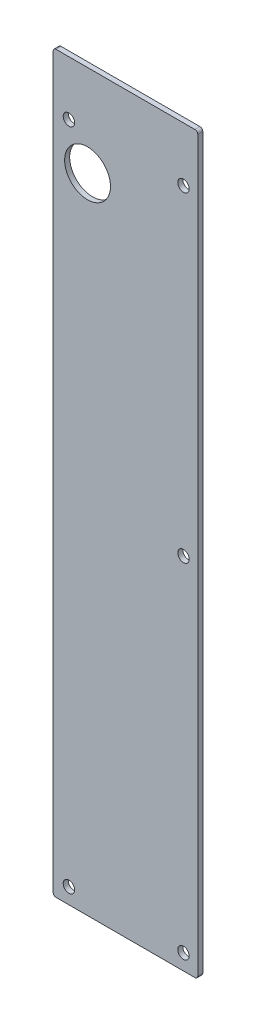
ISO-10303-21;
HEADER;
FILE_DESCRIPTION(('STEP AP214'),'2;1');
FILE_NAME('part.step','',(''),(''),'','','');
FILE_SCHEMA(('AUTOMOTIVE_DESIGN { 1 0 10303 214 1 1 1 1 }'));
ENDSEC;
DATA;
#1=APPLICATION_CONTEXT('core data for automotive mechanical design processes');
#2=APPLICATION_PROTOCOL_DEFINITION('international standard','automotive_design',2000,#1);
#3=PRODUCT_CONTEXT('',#1,'mechanical');
#4=PRODUCT('Part','Part','',(#3));
#5=PRODUCT_RELATED_PRODUCT_CATEGORY('part','',(#4));
#6=PRODUCT_DEFINITION_FORMATION('','',#4);
#7=PRODUCT_DEFINITION_CONTEXT('part definition',#1,'design');
#8=PRODUCT_DEFINITION('design','',#6,#7);
#9=PRODUCT_DEFINITION_SHAPE('','',#8);
#10=(LENGTH_UNIT() NAMED_UNIT(*) SI_UNIT(.MILLI.,.METRE.));
#11=(NAMED_UNIT(*) PLANE_ANGLE_UNIT() SI_UNIT($,.RADIAN.));
#12=(NAMED_UNIT(*) SI_UNIT($,.STERADIAN.) SOLID_ANGLE_UNIT());
#13=UNCERTAINTY_MEASURE_WITH_UNIT(LENGTH_MEASURE(1.E-05),#10,'distance_accuracy_value','');
#14=(GEOMETRIC_REPRESENTATION_CONTEXT(3) GLOBAL_UNCERTAINTY_ASSIGNED_CONTEXT((#13)) GLOBAL_UNIT_ASSIGNED_CONTEXT((#10,
#11,#12)) REPRESENTATION_CONTEXT('',''));
#15=CARTESIAN_POINT('',(0.,0.,0.));
#16=DIRECTION('',(0.,0.,1.));
#17=DIRECTION('',(1.,0.,0.));
#18=AXIS2_PLACEMENT_3D('',#15,#16,#17);
#19=CARTESIAN_POINT('',(0.,0.,5.588));
#20=DIRECTION('',(1.,0.,0.));
#21=DIRECTION('',(0.,0.,-1.));
#22=AXIS2_PLACEMENT_3D('',#19,#20,#21);
#23=PLANE('',#22);
#24=DIRECTION('',(0.,-1.,0.));
#25=VECTOR('',#24,1.);
#26=CARTESIAN_POINT('',(0.,0.,0.));
#27=LINE('',#26,#25);
#28=CARTESIAN_POINT('',(0.,811.2125,0.));
#29=VERTEX_POINT('',#28);
#30=CARTESIAN_POINT('',(0.,3.175,0.));
#31=VERTEX_POINT('',#30);
#32=EDGE_CURVE('E127',#29,#31,#27,.T.);
#33=ORIENTED_EDGE('',*,*,#32,.T.);
#34=DIRECTION('',(0.,0.,-1.));
#35=VECTOR('',#34,1.);
#36=CARTESIAN_POINT('',(0.,3.175,5.588));
#37=LINE('',#36,#35);
#38=CARTESIAN_POINT('',(0.,3.175,5.588));
#39=VERTEX_POINT('',#38);
#40=EDGE_CURVE('E105',#31,#39,#37,.F.);
#41=ORIENTED_EDGE('',*,*,#40,.T.);
#42=DIRECTION('',(0.,-1.,0.));
#43=VECTOR('',#42,1.);
#44=CARTESIAN_POINT('',(0.,0.,5.588));
#45=LINE('',#44,#43);
#46=CARTESIAN_POINT('',(0.,811.2125,5.588));
#47=VERTEX_POINT('',#46);
#48=EDGE_CURVE('E137',#47,#39,#45,.T.);
#49=ORIENTED_EDGE('',*,*,#48,.F.);
#50=DIRECTION('',(0.,0.,-1.));
#51=VECTOR('',#50,1.);
#52=CARTESIAN_POINT('',(0.,811.2125,5.588));
#53=LINE('',#52,#51);
#54=EDGE_CURVE('E110',#47,#29,#53,.T.);
#55=ORIENTED_EDGE('',*,*,#54,.T.);
#56=EDGE_LOOP('',(#33,#41,#49,#55));
#57=FACE_BOUND('',#56,.T.);
#58=ADVANCED_FACE('F33',(#57),#23,.F.);
#59=CARTESIAN_POINT('',(0.,0.,5.588));
#60=DIRECTION('',(0.,1.,0.));
#61=DIRECTION('',(0.,0.,1.));
#62=AXIS2_PLACEMENT_3D('',#59,#60,#61);
#63=PLANE('',#62);
#64=DIRECTION('',(1.,0.,0.));
#65=VECTOR('',#64,1.);
#66=CARTESIAN_POINT('',(0.,0.,5.588));
#67=LINE('',#66,#65);
#68=CARTESIAN_POINT('',(3.175,0.,5.588));
#69=VERTEX_POINT('',#68);
#70=CARTESIAN_POINT('',(157.1625,0.,5.588));
#71=VERTEX_POINT('',#70);
#72=EDGE_CURVE('E120',#69,#71,#67,.T.);
#73=ORIENTED_EDGE('',*,*,#72,.F.);
#74=DIRECTION('',(0.,0.,-1.));
#75=VECTOR('',#74,1.);
#76=CARTESIAN_POINT('',(3.175,0.,5.588));
#77=LINE('',#76,#75);
#78=CARTESIAN_POINT('',(3.175,0.,0.));
#79=VERTEX_POINT('',#78);
#80=EDGE_CURVE('E104',#69,#79,#77,.T.);
#81=ORIENTED_EDGE('',*,*,#80,.T.);
#82=DIRECTION('',(1.,0.,0.));
#83=VECTOR('',#82,1.);
#84=CARTESIAN_POINT('',(0.,0.,0.));
#85=LINE('',#84,#83);
#86=CARTESIAN_POINT('',(157.1625,0.,0.));
#87=VERTEX_POINT('',#86);
#88=EDGE_CURVE('E117',#79,#87,#85,.T.);
#89=ORIENTED_EDGE('',*,*,#88,.T.);
#90=DIRECTION('',(0.,0.,-1.));
#91=VECTOR('',#90,1.);
#92=CARTESIAN_POINT('',(157.1625,0.,5.588));
#93=LINE('',#92,#91);
#94=EDGE_CURVE('E122',#87,#71,#93,.F.);
#95=ORIENTED_EDGE('',*,*,#94,.T.);
#96=EDGE_LOOP('',(#73,#81,#89,#95));
#97=FACE_BOUND('',#96,.T.);
#98=ADVANCED_FACE('F116',(#97),#63,.F.);
#99=CARTESIAN_POINT('',(160.3375,0.,5.588));
#100=DIRECTION('',(-1.,0.,0.));
#101=DIRECTION('',(0.,0.,1.));
#102=AXIS2_PLACEMENT_3D('',#99,#100,#101);
#103=PLANE('',#102);
#104=DIRECTION('',(0.,1.,0.));
#105=VECTOR('',#104,1.);
#106=CARTESIAN_POINT('',(160.3375,0.,5.588));
#107=LINE('',#106,#105);
#108=CARTESIAN_POINT('',(160.3375,3.175,5.588));
#109=VERTEX_POINT('',#108);
#110=CARTESIAN_POINT('',(160.3375,811.2125,5.588));
#111=VERTEX_POINT('',#110);
#112=EDGE_CURVE('E194',#109,#111,#107,.T.);
#113=ORIENTED_EDGE('',*,*,#112,.F.);
#114=DIRECTION('',(0.,0.,-1.));
#115=VECTOR('',#114,1.);
#116=CARTESIAN_POINT('',(160.3375,3.175,5.588));
#117=LINE('',#116,#115);
#118=CARTESIAN_POINT('',(160.3375,3.175,0.));
#119=VERTEX_POINT('',#118);
#120=EDGE_CURVE('E156',#109,#119,#117,.T.);
#121=ORIENTED_EDGE('',*,*,#120,.T.);
#122=DIRECTION('',(0.,1.,0.));
#123=VECTOR('',#122,1.);
#124=CARTESIAN_POINT('',(160.3375,0.,0.));
#125=LINE('',#124,#123);
#126=CARTESIAN_POINT('',(160.3375,811.2125,0.));
#127=VERTEX_POINT('',#126);
#128=EDGE_CURVE('E126',#119,#127,#125,.T.);
#129=ORIENTED_EDGE('',*,*,#128,.T.);
#130=DIRECTION('',(0.,0.,-1.));
#131=VECTOR('',#130,1.);
#132=CARTESIAN_POINT('',(160.3375,811.2125,5.588));
#133=LINE('',#132,#131);
#134=EDGE_CURVE('E154',#127,#111,#133,.F.);
#135=ORIENTED_EDGE('',*,*,#134,.T.);
#136=EDGE_LOOP('',(#113,#121,#129,#135));
#137=FACE_BOUND('',#136,.T.);
#138=ADVANCED_FACE('F209',(#137),#103,.F.);
#139=CARTESIAN_POINT('',(0.,814.3875,5.588));
#140=DIRECTION('',(0.,-1.,0.));
#141=DIRECTION('',(0.,0.,-1.));
#142=AXIS2_PLACEMENT_3D('',#139,#140,#141);
#143=PLANE('',#142);
#144=DIRECTION('',(-1.,0.,0.));
#145=VECTOR('',#144,1.);
#146=CARTESIAN_POINT('',(0.,814.3875,0.));
#147=LINE('',#146,#145);
#148=CARTESIAN_POINT('',(157.1625,814.3875,0.));
#149=VERTEX_POINT('',#148);
#150=CARTESIAN_POINT('',(3.175,814.3875,0.));
#151=VERTEX_POINT('',#150);
#152=EDGE_CURVE('E130',#149,#151,#147,.T.);
#153=ORIENTED_EDGE('',*,*,#152,.T.);
#154=DIRECTION('',(0.,0.,-1.));
#155=VECTOR('',#154,1.);
#156=CARTESIAN_POINT('',(3.175,814.3875,5.588));
#157=LINE('',#156,#155);
#158=CARTESIAN_POINT('',(3.175,814.3875,5.588));
#159=VERTEX_POINT('',#158);
#160=EDGE_CURVE('E11',#151,#159,#157,.F.);
#161=ORIENTED_EDGE('',*,*,#160,.T.);
#162=DIRECTION('',(-1.,0.,0.));
#163=VECTOR('',#162,1.);
#164=CARTESIAN_POINT('',(0.,814.3875,5.588));
#165=LINE('',#164,#163);
#166=CARTESIAN_POINT('',(157.1625,814.3875,5.588));
#167=VERTEX_POINT('',#166);
#168=EDGE_CURVE('E138',#167,#159,#165,.T.);
#169=ORIENTED_EDGE('',*,*,#168,.F.);
#170=DIRECTION('',(0.,0.,-1.));
#171=VECTOR('',#170,1.);
#172=CARTESIAN_POINT('',(157.1625,814.3875,5.588));
#173=LINE('',#172,#171);
#174=EDGE_CURVE('E42',#167,#149,#173,.T.);
#175=ORIENTED_EDGE('',*,*,#174,.T.);
#176=EDGE_LOOP('',(#153,#161,#169,#175));
#177=FACE_BOUND('',#176,.T.);
#178=ADVANCED_FACE('F204',(#177),#143,.F.);
#179=CARTESIAN_POINT('',(0.,0.,5.588));
#180=DIRECTION('',(0.,0.,-1.));
#181=DIRECTION('',(-1.,0.,0.));
#182=AXIS2_PLACEMENT_3D('',#179,#180,#181);
#183=PLANE('',#182);
#184=CARTESIAN_POINT('',(38.1,712.7875,5.588));
#185=DIRECTION('',(0.,0.,1.));
#186=DIRECTION('',(1.,0.,0.));
#187=AXIS2_PLACEMENT_3D('',#184,#185,#186);
#188=CIRCLE('',#187,25.4);
#189=CARTESIAN_POINT('',(63.5,712.7875,5.588));
#190=VERTEX_POINT('',#189);
#191=EDGE_CURVE('E268',#190,#190,#188,.T.);
#192=ORIENTED_EDGE('',*,*,#191,.F.);
#193=EDGE_LOOP('',(#192));
#194=FACE_BOUND('',#193,.T.);
#195=CARTESIAN_POINT('',(144.4625,398.4625,5.588));
#196=DIRECTION('',(0.,0.,1.));
#197=DIRECTION('',(1.,0.,0.));
#198=AXIS2_PLACEMENT_3D('',#195,#196,#197);
#199=CIRCLE('',#198,6.34999999999999);
#200=CARTESIAN_POINT('',(150.8125,398.4625,5.588));
#201=VERTEX_POINT('',#200);
#202=EDGE_CURVE('E183',#201,#201,#199,.T.);
#203=ORIENTED_EDGE('',*,*,#202,.F.);
#204=EDGE_LOOP('',(#203));
#205=FACE_BOUND('',#204,.T.);
#206=CARTESIAN_POINT('',(144.4625,17.4624999999999,5.588));
#207=DIRECTION('',(0.,0.,1.));
#208=DIRECTION('',(1.,0.,0.));
#209=AXIS2_PLACEMENT_3D('',#206,#207,#208);
#210=CIRCLE('',#209,6.35);
#211=CARTESIAN_POINT('',(150.8125,17.4624999999999,5.588));
#212=VERTEX_POINT('',#211);
#213=EDGE_CURVE('E173',#212,#212,#210,.T.);
#214=ORIENTED_EDGE('',*,*,#213,.F.);
#215=EDGE_LOOP('',(#214));
#216=FACE_BOUND('',#215,.T.);
#217=CARTESIAN_POINT('',(17.4625000000001,17.4624999999999,5.588));
#218=DIRECTION('',(0.,0.,1.));
#219=DIRECTION('',(1.,0.,0.));
#220=AXIS2_PLACEMENT_3D('',#217,#218,#219);
#221=CIRCLE('',#220,6.35);
#222=CARTESIAN_POINT('',(23.8125000000001,17.4624999999999,5.588));
#223=VERTEX_POINT('',#222);
#224=EDGE_CURVE('E170',#223,#223,#221,.T.);
#225=ORIENTED_EDGE('',*,*,#224,.F.);
#226=EDGE_LOOP('',(#225));
#227=FACE_BOUND('',#226,.T.);
#228=CARTESIAN_POINT('',(144.4625,754.0625,5.588));
#229=DIRECTION('',(0.,0.,1.));
#230=DIRECTION('',(1.,0.,0.));
#231=AXIS2_PLACEMENT_3D('',#228,#229,#230);
#232=CIRCLE('',#231,6.34999999999999);
#233=CARTESIAN_POINT('',(150.8125,754.0625,5.588));
#234=VERTEX_POINT('',#233);
#235=EDGE_CURVE('E167',#234,#234,#232,.T.);
#236=ORIENTED_EDGE('',*,*,#235,.F.);
#237=EDGE_LOOP('',(#236));
#238=FACE_BOUND('',#237,.T.);
#239=CARTESIAN_POINT('',(17.4625,754.0625,5.588));
#240=DIRECTION('',(0.,0.,1.));
#241=DIRECTION('',(1.,0.,0.));
#242=AXIS2_PLACEMENT_3D('',#239,#240,#241);
#243=CIRCLE('',#242,6.35);
#244=CARTESIAN_POINT('',(23.8125,754.0625,5.588));
#245=VERTEX_POINT('',#244);
#246=EDGE_CURVE('E163',#245,#245,#243,.T.);
#247=ORIENTED_EDGE('',*,*,#246,.F.);
#248=EDGE_LOOP('',(#247));
#249=FACE_BOUND('',#248,.T.);
#250=ORIENTED_EDGE('',*,*,#48,.T.);
#251=CARTESIAN_POINT('',(3.175,3.175,5.588));
#252=DIRECTION('',(0.,0.,-1.));
#253=DIRECTION('',(-1.,0.,0.));
#254=AXIS2_PLACEMENT_3D('',#251,#252,#253);
#255=CIRCLE('',#254,3.175);
#256=EDGE_CURVE('E152',#39,#69,#255,.F.);
#257=ORIENTED_EDGE('',*,*,#256,.T.);
#258=ORIENTED_EDGE('',*,*,#72,.T.);
#259=CARTESIAN_POINT('',(157.1625,3.175,5.588));
#260=DIRECTION('',(0.,0.,-1.));
#261=DIRECTION('',(-1.,0.,0.));
#262=AXIS2_PLACEMENT_3D('',#259,#260,#261);
#263=CIRCLE('',#262,3.175);
#264=EDGE_CURVE('E150',#71,#109,#263,.F.);
#265=ORIENTED_EDGE('',*,*,#264,.T.);
#266=ORIENTED_EDGE('',*,*,#112,.T.);
#267=CARTESIAN_POINT('',(157.1625,811.2125,5.588));
#268=DIRECTION('',(0.,0.,-1.));
#269=DIRECTION('',(-1.,0.,0.));
#270=AXIS2_PLACEMENT_3D('',#267,#268,#269);
#271=CIRCLE('',#270,3.175);
#272=EDGE_CURVE('E55',#111,#167,#271,.F.);
#273=ORIENTED_EDGE('',*,*,#272,.T.);
#274=ORIENTED_EDGE('',*,*,#168,.T.);
#275=CARTESIAN_POINT('',(3.175,811.2125,5.588));
#276=DIRECTION('',(0.,0.,-1.));
#277=DIRECTION('',(-1.,0.,0.));
#278=AXIS2_PLACEMENT_3D('',#275,#276,#277);
#279=CIRCLE('',#278,3.175);
#280=EDGE_CURVE('E148',#159,#47,#279,.F.);
#281=ORIENTED_EDGE('',*,*,#280,.T.);
#282=EDGE_LOOP('',(#250,#257,#258,#265,#266,#273,#274,#281));
#283=FACE_BOUND('',#282,.T.);
#284=ADVANCED_FACE('F196',(#194,#205,#216,#227,#238,#249,#283),#183,.F.);
#285=CARTESIAN_POINT('',(0.,0.,0.));
#286=DIRECTION('',(0.,0.,-1.));
#287=DIRECTION('',(-1.,0.,0.));
#288=AXIS2_PLACEMENT_3D('',#285,#286,#287);
#289=PLANE('',#288);
#290=CARTESIAN_POINT('',(38.1,712.7875,0.));
#291=DIRECTION('',(0.,0.,1.));
#292=DIRECTION('',(1.,0.,0.));
#293=AXIS2_PLACEMENT_3D('',#290,#291,#292);
#294=CIRCLE('',#293,25.4);
#295=CARTESIAN_POINT('',(63.5,712.7875,0.));
#296=VERTEX_POINT('',#295);
#297=EDGE_CURVE('E265',#296,#296,#294,.T.);
#298=ORIENTED_EDGE('',*,*,#297,.T.);
#299=EDGE_LOOP('',(#298));
#300=FACE_BOUND('',#299,.T.);
#301=CARTESIAN_POINT('',(144.4625,398.4625,0.));
#302=DIRECTION('',(0.,0.,-1.));
#303=DIRECTION('',(-1.,0.,0.));
#304=AXIS2_PLACEMENT_3D('',#301,#302,#303);
#305=CIRCLE('',#304,6.34999999999999);
#306=CARTESIAN_POINT('',(138.1125,398.4625,0.));
#307=VERTEX_POINT('',#306);
#308=EDGE_CURVE('E37',#307,#307,#305,.T.);
#309=ORIENTED_EDGE('',*,*,#308,.F.);
#310=EDGE_LOOP('',(#309));
#311=FACE_BOUND('',#310,.T.);
#312=CARTESIAN_POINT('',(144.4625,17.4624999999999,0.));
#313=DIRECTION('',(0.,0.,-1.));
#314=DIRECTION('',(-1.,0.,0.));
#315=AXIS2_PLACEMENT_3D('',#312,#313,#314);
#316=CIRCLE('',#315,6.35);
#317=CARTESIAN_POINT('',(138.1125,17.4624999999999,0.));
#318=VERTEX_POINT('',#317);
#319=EDGE_CURVE('E171',#318,#318,#316,.T.);
#320=ORIENTED_EDGE('',*,*,#319,.F.);
#321=EDGE_LOOP('',(#320));
#322=FACE_BOUND('',#321,.T.);
#323=CARTESIAN_POINT('',(17.4625000000001,17.4624999999999,0.));
#324=DIRECTION('',(0.,0.,-1.));
#325=DIRECTION('',(-1.,0.,0.));
#326=AXIS2_PLACEMENT_3D('',#323,#324,#325);
#327=CIRCLE('',#326,6.35);
#328=CARTESIAN_POINT('',(11.1125000000001,17.4624999999999,0.));
#329=VERTEX_POINT('',#328);
#330=EDGE_CURVE('E168',#329,#329,#327,.T.);
#331=ORIENTED_EDGE('',*,*,#330,.F.);
#332=EDGE_LOOP('',(#331));
#333=FACE_BOUND('',#332,.T.);
#334=CARTESIAN_POINT('',(144.4625,754.0625,0.));
#335=DIRECTION('',(0.,0.,-1.));
#336=DIRECTION('',(-1.,0.,0.));
#337=AXIS2_PLACEMENT_3D('',#334,#335,#336);
#338=CIRCLE('',#337,6.34999999999999);
#339=CARTESIAN_POINT('',(138.1125,754.0625,0.));
#340=VERTEX_POINT('',#339);
#341=EDGE_CURVE('E164',#340,#340,#338,.T.);
#342=ORIENTED_EDGE('',*,*,#341,.F.);
#343=EDGE_LOOP('',(#342));
#344=FACE_BOUND('',#343,.T.);
#345=CARTESIAN_POINT('',(17.4625,754.0625,0.));
#346=DIRECTION('',(0.,0.,-1.));
#347=DIRECTION('',(-1.,0.,0.));
#348=AXIS2_PLACEMENT_3D('',#345,#346,#347);
#349=CIRCLE('',#348,6.35);
#350=CARTESIAN_POINT('',(11.1125,754.0625,0.));
#351=VERTEX_POINT('',#350);
#352=EDGE_CURVE('E132',#351,#351,#349,.T.);
#353=ORIENTED_EDGE('',*,*,#352,.F.);
#354=EDGE_LOOP('',(#353));
#355=FACE_BOUND('',#354,.T.);
#356=ORIENTED_EDGE('',*,*,#88,.F.);
#357=CARTESIAN_POINT('',(3.175,3.175,0.));
#358=DIRECTION('',(0.,0.,-1.));
#359=DIRECTION('',(-1.,0.,0.));
#360=AXIS2_PLACEMENT_3D('',#357,#358,#359);
#361=CIRCLE('',#360,3.175);
#362=EDGE_CURVE('E100',#79,#31,#361,.T.);
#363=ORIENTED_EDGE('',*,*,#362,.T.);
#364=ORIENTED_EDGE('',*,*,#32,.F.);
#365=CARTESIAN_POINT('',(3.175,811.2125,0.));
#366=DIRECTION('',(0.,0.,-1.));
#367=DIRECTION('',(-1.,0.,0.));
#368=AXIS2_PLACEMENT_3D('',#365,#366,#367);
#369=CIRCLE('',#368,3.175);
#370=EDGE_CURVE('E141',#29,#151,#369,.T.);
#371=ORIENTED_EDGE('',*,*,#370,.T.);
#372=ORIENTED_EDGE('',*,*,#152,.F.);
#373=CARTESIAN_POINT('',(157.1625,811.2125,0.));
#374=DIRECTION('',(0.,0.,-1.));
#375=DIRECTION('',(-1.,0.,0.));
#376=AXIS2_PLACEMENT_3D('',#373,#374,#375);
#377=CIRCLE('',#376,3.175);
#378=EDGE_CURVE('E121',#149,#127,#377,.T.);
#379=ORIENTED_EDGE('',*,*,#378,.T.);
#380=ORIENTED_EDGE('',*,*,#128,.F.);
#381=CARTESIAN_POINT('',(157.1625,3.175,0.));
#382=DIRECTION('',(0.,0.,-1.));
#383=DIRECTION('',(-1.,0.,0.));
#384=AXIS2_PLACEMENT_3D('',#381,#382,#383);
#385=CIRCLE('',#384,3.175);
#386=EDGE_CURVE('E111',#119,#87,#385,.T.);
#387=ORIENTED_EDGE('',*,*,#386,.T.);
#388=EDGE_LOOP('',(#356,#363,#364,#371,#372,#379,#380,#387));
#389=FACE_BOUND('',#388,.T.);
#390=ADVANCED_FACE('F124',(#300,#311,#322,#333,#344,#355,#389),#289,.T.);
#391=CARTESIAN_POINT('',(3.175,3.175,5.588));
#392=DIRECTION('',(0.,0.,-1.));
#393=DIRECTION('',(-1.,0.,0.));
#394=AXIS2_PLACEMENT_3D('',#391,#392,#393);
#395=CYLINDRICAL_SURFACE('',#394,3.175);
#396=ORIENTED_EDGE('',*,*,#256,.F.);
#397=ORIENTED_EDGE('',*,*,#40,.F.);
#398=ORIENTED_EDGE('',*,*,#362,.F.);
#399=ORIENTED_EDGE('',*,*,#80,.F.);
#400=EDGE_LOOP('',(#396,#397,#398,#399));
#401=FACE_BOUND('',#400,.T.);
#402=ADVANCED_FACE('F103',(#401),#395,.T.);
#403=CARTESIAN_POINT('',(157.1625,3.175,5.588));
#404=DIRECTION('',(0.,0.,-1.));
#405=DIRECTION('',(-1.,0.,0.));
#406=AXIS2_PLACEMENT_3D('',#403,#404,#405);
#407=CYLINDRICAL_SURFACE('',#406,3.175);
#408=ORIENTED_EDGE('',*,*,#264,.F.);
#409=ORIENTED_EDGE('',*,*,#94,.F.);
#410=ORIENTED_EDGE('',*,*,#386,.F.);
#411=ORIENTED_EDGE('',*,*,#120,.F.);
#412=EDGE_LOOP('',(#408,#409,#410,#411));
#413=FACE_BOUND('',#412,.T.);
#414=ADVANCED_FACE('F213',(#413),#407,.T.);
#415=CARTESIAN_POINT('',(3.175,811.2125,5.588));
#416=DIRECTION('',(0.,0.,-1.));
#417=DIRECTION('',(-1.,0.,0.));
#418=AXIS2_PLACEMENT_3D('',#415,#416,#417);
#419=CYLINDRICAL_SURFACE('',#418,3.175);
#420=ORIENTED_EDGE('',*,*,#280,.F.);
#421=ORIENTED_EDGE('',*,*,#160,.F.);
#422=ORIENTED_EDGE('',*,*,#370,.F.);
#423=ORIENTED_EDGE('',*,*,#54,.F.);
#424=EDGE_LOOP('',(#420,#421,#422,#423));
#425=FACE_BOUND('',#424,.T.);
#426=ADVANCED_FACE('F201',(#425),#419,.T.);
#427=CARTESIAN_POINT('',(157.1625,811.2125,5.588));
#428=DIRECTION('',(0.,0.,-1.));
#429=DIRECTION('',(-1.,0.,0.));
#430=AXIS2_PLACEMENT_3D('',#427,#428,#429);
#431=CYLINDRICAL_SURFACE('',#430,3.175);
#432=ORIENTED_EDGE('',*,*,#272,.F.);
#433=ORIENTED_EDGE('',*,*,#134,.F.);
#434=ORIENTED_EDGE('',*,*,#378,.F.);
#435=ORIENTED_EDGE('',*,*,#174,.F.);
#436=EDGE_LOOP('',(#432,#433,#434,#435));
#437=FACE_BOUND('',#436,.T.);
#438=ADVANCED_FACE('F35',(#437),#431,.T.);
#439=CARTESIAN_POINT('',(17.4625,754.0625,-0.762));
#440=DIRECTION('',(0.,0.,1.));
#441=DIRECTION('',(1.,0.,0.));
#442=AXIS2_PLACEMENT_3D('',#439,#440,#441);
#443=CYLINDRICAL_SURFACE('',#442,6.35);
#444=ORIENTED_EDGE('',*,*,#352,.T.);
#445=EDGE_LOOP('',(#444));
#446=FACE_BOUND('',#445,.T.);
#447=ORIENTED_EDGE('',*,*,#246,.T.);
#448=EDGE_LOOP('',(#447));
#449=FACE_BOUND('',#448,.T.);
#450=ADVANCED_FACE('F238',(#446,#449),#443,.F.);
#451=CARTESIAN_POINT('',(144.4625,754.0625,-0.762));
#452=DIRECTION('',(0.,0.,1.));
#453=DIRECTION('',(1.,0.,0.));
#454=AXIS2_PLACEMENT_3D('',#451,#452,#453);
#455=CYLINDRICAL_SURFACE('',#454,6.34999999999999);
#456=ORIENTED_EDGE('',*,*,#341,.T.);
#457=EDGE_LOOP('',(#456));
#458=FACE_BOUND('',#457,.T.);
#459=ORIENTED_EDGE('',*,*,#235,.T.);
#460=EDGE_LOOP('',(#459));
#461=FACE_BOUND('',#460,.T.);
#462=ADVANCED_FACE('F241',(#458,#461),#455,.F.);
#463=CARTESIAN_POINT('',(17.4625000000001,17.4624999999999,-0.762));
#464=DIRECTION('',(0.,0.,1.));
#465=DIRECTION('',(1.,0.,0.));
#466=AXIS2_PLACEMENT_3D('',#463,#464,#465);
#467=CYLINDRICAL_SURFACE('',#466,6.35);
#468=ORIENTED_EDGE('',*,*,#330,.T.);
#469=EDGE_LOOP('',(#468));
#470=FACE_BOUND('',#469,.T.);
#471=ORIENTED_EDGE('',*,*,#224,.T.);
#472=EDGE_LOOP('',(#471));
#473=FACE_BOUND('',#472,.T.);
#474=ADVANCED_FACE('F245',(#470,#473),#467,.F.);
#475=CARTESIAN_POINT('',(144.4625,17.4624999999999,-0.762));
#476=DIRECTION('',(0.,0.,1.));
#477=DIRECTION('',(1.,0.,0.));
#478=AXIS2_PLACEMENT_3D('',#475,#476,#477);
#479=CYLINDRICAL_SURFACE('',#478,6.35);
#480=ORIENTED_EDGE('',*,*,#319,.T.);
#481=EDGE_LOOP('',(#480));
#482=FACE_BOUND('',#481,.T.);
#483=ORIENTED_EDGE('',*,*,#213,.T.);
#484=EDGE_LOOP('',(#483));
#485=FACE_BOUND('',#484,.T.);
#486=ADVANCED_FACE('F249',(#482,#485),#479,.F.);
#487=CARTESIAN_POINT('',(144.4625,398.4625,-0.762));
#488=DIRECTION('',(0.,0.,1.));
#489=DIRECTION('',(1.,0.,0.));
#490=AXIS2_PLACEMENT_3D('',#487,#488,#489);
#491=CYLINDRICAL_SURFACE('',#490,6.34999999999999);
#492=ORIENTED_EDGE('',*,*,#308,.T.);
#493=EDGE_LOOP('',(#492));
#494=FACE_BOUND('',#493,.T.);
#495=ORIENTED_EDGE('',*,*,#202,.T.);
#496=EDGE_LOOP('',(#495));
#497=FACE_BOUND('',#496,.T.);
#498=ADVANCED_FACE('F253',(#494,#497),#491,.F.);
#499=CARTESIAN_POINT('',(38.1,712.7875,0.));
#500=DIRECTION('',(0.,0.,1.));
#501=DIRECTION('',(1.,0.,0.));
#502=AXIS2_PLACEMENT_3D('',#499,#500,#501);
#503=CYLINDRICAL_SURFACE('',#502,25.4);
#504=ORIENTED_EDGE('',*,*,#297,.F.);
#505=EDGE_LOOP('',(#504));
#506=FACE_BOUND('',#505,.T.);
#507=ORIENTED_EDGE('',*,*,#191,.T.);
#508=EDGE_LOOP('',(#507));
#509=FACE_BOUND('',#508,.T.);
#510=ADVANCED_FACE('F256',(#506,#509),#503,.F.);
#511=CLOSED_SHELL('',(#58,#98,#138,#178,#284,#390,#402,#414,#426,#438,#450,#462,#474,#486,#498,#510));
#512=MANIFOLD_SOLID_BREP('B2',#511);
#513=ADVANCED_BREP_SHAPE_REPRESENTATION('',(#18,#512),#14);
#514=SHAPE_DEFINITION_REPRESENTATION(#9,#513);
ENDSEC;
END-ISO-10303-21;
